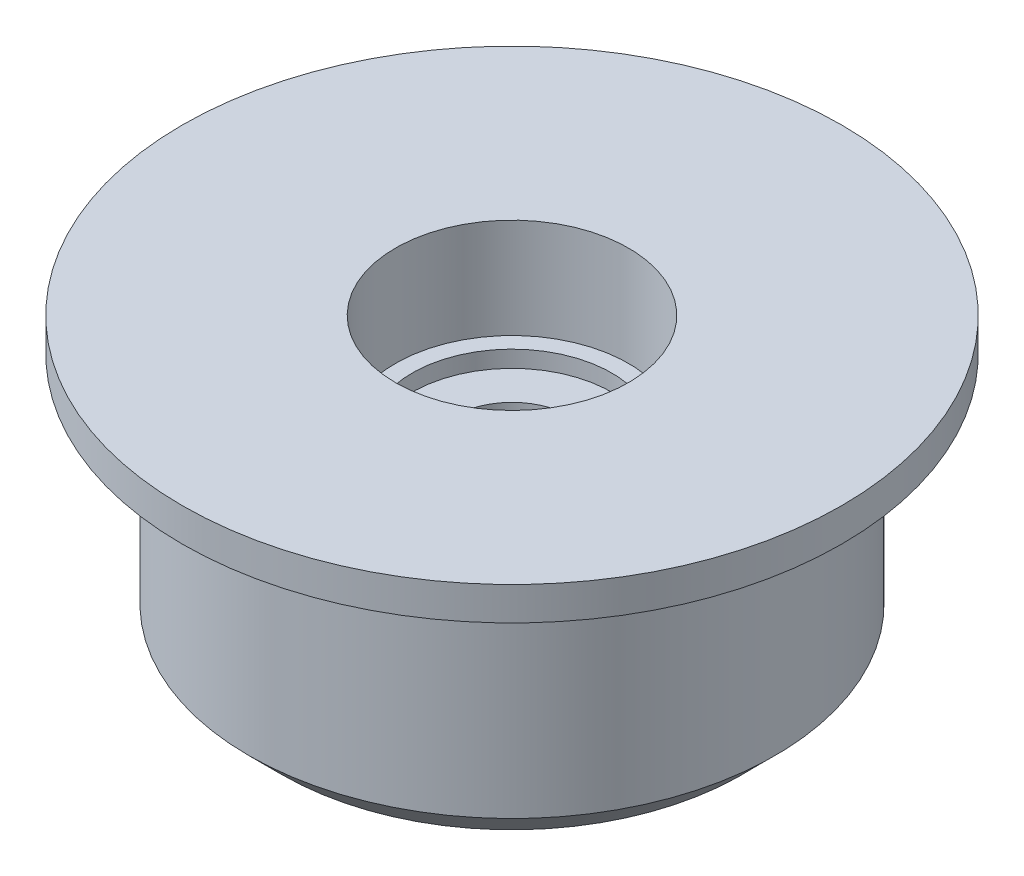
ISO-10303-21;
HEADER;
FILE_DESCRIPTION(('STEP AP214'),'2;1');
FILE_NAME('part.step','',(''),(''),'','','');
FILE_SCHEMA(('AUTOMOTIVE_DESIGN { 1 0 10303 214 1 1 1 1 }'));
ENDSEC;
DATA;
#1=APPLICATION_CONTEXT('core data for automotive mechanical design processes');
#2=APPLICATION_PROTOCOL_DEFINITION('international standard','automotive_design',2000,#1);
#3=PRODUCT_CONTEXT('',#1,'mechanical');
#4=PRODUCT('Part','Part','',(#3));
#5=PRODUCT_RELATED_PRODUCT_CATEGORY('part','',(#4));
#6=PRODUCT_DEFINITION_FORMATION('','',#4);
#7=PRODUCT_DEFINITION_CONTEXT('part definition',#1,'design');
#8=PRODUCT_DEFINITION('design','',#6,#7);
#9=PRODUCT_DEFINITION_SHAPE('','',#8);
#10=(LENGTH_UNIT() NAMED_UNIT(*) SI_UNIT(.MILLI.,.METRE.));
#11=(NAMED_UNIT(*) PLANE_ANGLE_UNIT() SI_UNIT($,.RADIAN.));
#12=(NAMED_UNIT(*) SI_UNIT($,.STERADIAN.) SOLID_ANGLE_UNIT());
#13=UNCERTAINTY_MEASURE_WITH_UNIT(LENGTH_MEASURE(1.E-05),#10,'distance_accuracy_value','');
#14=(GEOMETRIC_REPRESENTATION_CONTEXT(3) GLOBAL_UNCERTAINTY_ASSIGNED_CONTEXT((#13)) GLOBAL_UNIT_ASSIGNED_CONTEXT((#10,
#11,#12)) REPRESENTATION_CONTEXT('',''));
#15=CARTESIAN_POINT('',(0.,0.,0.));
#16=DIRECTION('',(0.,0.,1.));
#17=DIRECTION('',(1.,0.,0.));
#18=AXIS2_PLACEMENT_3D('',#15,#16,#17);
#19=CARTESIAN_POINT('',(0.,37.275,0.));
#20=DIRECTION('',(0.,1.,0.));
#21=DIRECTION('',(0.,0.,1.));
#22=AXIS2_PLACEMENT_3D('',#19,#20,#21);
#23=CYLINDRICAL_SURFACE('',#22,1.75);
#24=CARTESIAN_POINT('',(0.,0.,0.));
#25=DIRECTION('',(0.,1.,0.));
#26=DIRECTION('',(0.,0.,1.));
#27=AXIS2_PLACEMENT_3D('',#24,#25,#26);
#28=CIRCLE('',#27,1.75);
#29=CARTESIAN_POINT('',(0.,0.,1.75));
#30=VERTEX_POINT('',#29);
#31=EDGE_CURVE('E41',#30,#30,#28,.T.);
#32=ORIENTED_EDGE('',*,*,#31,.F.);
#33=EDGE_LOOP('',(#32));
#34=FACE_BOUND('',#33,.T.);
#35=CARTESIAN_POINT('',(0.,5.,0.));
#36=DIRECTION('',(0.,1.,0.));
#37=DIRECTION('',(0.,0.,1.));
#38=AXIS2_PLACEMENT_3D('',#35,#36,#37);
#39=CIRCLE('',#38,1.75);
#40=CARTESIAN_POINT('',(0.,5.,1.75));
#41=VERTEX_POINT('',#40);
#42=EDGE_CURVE('E68',#41,#41,#39,.T.);
#43=ORIENTED_EDGE('',*,*,#42,.T.);
#44=EDGE_LOOP('',(#43));
#45=FACE_BOUND('',#44,.T.);
#46=ADVANCED_FACE('F30',(#34,#45),#23,.F.);
#47=CARTESIAN_POINT('',(1.75,0.,0.));
#48=DIRECTION('',(0.,1.,0.));
#49=DIRECTION('',(0.,0.,1.));
#50=AXIS2_PLACEMENT_3D('',#47,#48,#49);
#51=PLANE('',#50);
#52=CARTESIAN_POINT('',(0.,0.,0.));
#53=DIRECTION('',(0.,1.,0.));
#54=DIRECTION('',(0.,0.,1.));
#55=AXIS2_PLACEMENT_3D('',#52,#53,#54);
#56=CIRCLE('',#55,6.9);
#57=CARTESIAN_POINT('',(0.,0.,6.9));
#58=VERTEX_POINT('',#57);
#59=EDGE_CURVE('E10',#58,#58,#56,.F.);
#60=ORIENTED_EDGE('',*,*,#59,.T.);
#61=EDGE_LOOP('',(#60));
#62=FACE_BOUND('',#61,.T.);
#63=ORIENTED_EDGE('',*,*,#31,.T.);
#64=EDGE_LOOP('',(#63));
#65=FACE_BOUND('',#64,.T.);
#66=ADVANCED_FACE('F117',(#62,#65),#51,.F.);
#67=CARTESIAN_POINT('',(0.,37.275,0.));
#68=DIRECTION('',(0.,1.,0.));
#69=DIRECTION('',(0.,0.,1.));
#70=AXIS2_PLACEMENT_3D('',#67,#68,#69);
#71=CYLINDRICAL_SURFACE('',#70,7.9);
#72=CARTESIAN_POINT('',(0.,1.,0.));
#73=DIRECTION('',(0.,1.,0.));
#74=DIRECTION('',(0.,0.,1.));
#75=AXIS2_PLACEMENT_3D('',#72,#73,#74);
#76=CIRCLE('',#75,7.9);
#77=CARTESIAN_POINT('',(0.,1.,7.9));
#78=VERTEX_POINT('',#77);
#79=EDGE_CURVE('E37',#78,#78,#76,.T.);
#80=ORIENTED_EDGE('',*,*,#79,.T.);
#81=EDGE_LOOP('',(#80));
#82=FACE_BOUND('',#81,.T.);
#83=CARTESIAN_POINT('',(0.,7.5,0.));
#84=DIRECTION('',(0.,1.,0.));
#85=DIRECTION('',(0.,0.,1.));
#86=AXIS2_PLACEMENT_3D('',#83,#84,#85);
#87=CIRCLE('',#86,7.9);
#88=CARTESIAN_POINT('',(0.,7.5,7.9));
#89=VERTEX_POINT('',#88);
#90=EDGE_CURVE('E45',#89,#89,#87,.T.);
#91=ORIENTED_EDGE('',*,*,#90,.F.);
#92=EDGE_LOOP('',(#91));
#93=FACE_BOUND('',#92,.T.);
#94=ADVANCED_FACE('F112',(#82,#93),#71,.T.);
#95=CARTESIAN_POINT('',(9.9,7.5,0.));
#96=DIRECTION('',(0.,1.,0.));
#97=DIRECTION('',(0.,0.,1.));
#98=AXIS2_PLACEMENT_3D('',#95,#96,#97);
#99=PLANE('',#98);
#100=CARTESIAN_POINT('',(0.,7.5,0.));
#101=DIRECTION('',(0.,1.,0.));
#102=DIRECTION('',(0.,0.,1.));
#103=AXIS2_PLACEMENT_3D('',#100,#101,#102);
#104=CIRCLE('',#103,9.9);
#105=CARTESIAN_POINT('',(0.,7.5,9.9));
#106=VERTEX_POINT('',#105);
#107=EDGE_CURVE('E50',#106,#106,#104,.T.);
#108=ORIENTED_EDGE('',*,*,#107,.F.);
#109=EDGE_LOOP('',(#108));
#110=FACE_BOUND('',#109,.T.);
#111=ORIENTED_EDGE('',*,*,#90,.T.);
#112=EDGE_LOOP('',(#111));
#113=FACE_BOUND('',#112,.T.);
#114=ADVANCED_FACE('F106',(#110,#113),#99,.F.);
#115=CARTESIAN_POINT('',(0.,37.275,0.));
#116=DIRECTION('',(0.,1.,0.));
#117=DIRECTION('',(0.,0.,1.));
#118=AXIS2_PLACEMENT_3D('',#115,#116,#117);
#119=CYLINDRICAL_SURFACE('',#118,9.9);
#120=CARTESIAN_POINT('',(0.,8.5,0.));
#121=DIRECTION('',(0.,1.,0.));
#122=DIRECTION('',(0.,0.,1.));
#123=AXIS2_PLACEMENT_3D('',#120,#121,#122);
#124=CIRCLE('',#123,9.9);
#125=CARTESIAN_POINT('',(0.,8.5,9.9));
#126=VERTEX_POINT('',#125);
#127=EDGE_CURVE('E53',#126,#126,#124,.T.);
#128=ORIENTED_EDGE('',*,*,#127,.F.);
#129=EDGE_LOOP('',(#128));
#130=FACE_BOUND('',#129,.T.);
#131=ORIENTED_EDGE('',*,*,#107,.T.);
#132=EDGE_LOOP('',(#131));
#133=FACE_BOUND('',#132,.T.);
#134=ADVANCED_FACE('F100',(#130,#133),#119,.T.);
#135=CARTESIAN_POINT('',(3.5,8.5,0.));
#136=DIRECTION('',(0.,-1.,0.));
#137=DIRECTION('',(0.,0.,-1.));
#138=AXIS2_PLACEMENT_3D('',#135,#136,#137);
#139=PLANE('',#138);
#140=CARTESIAN_POINT('',(0.,8.5,0.));
#141=DIRECTION('',(0.,1.,0.));
#142=DIRECTION('',(0.,0.,1.));
#143=AXIS2_PLACEMENT_3D('',#140,#141,#142);
#144=CIRCLE('',#143,3.5);
#145=CARTESIAN_POINT('',(0.,8.5,3.5));
#146=VERTEX_POINT('',#145);
#147=EDGE_CURVE('E56',#146,#146,#144,.T.);
#148=ORIENTED_EDGE('',*,*,#147,.F.);
#149=EDGE_LOOP('',(#148));
#150=FACE_BOUND('',#149,.T.);
#151=ORIENTED_EDGE('',*,*,#127,.T.);
#152=EDGE_LOOP('',(#151));
#153=FACE_BOUND('',#152,.T.);
#154=ADVANCED_FACE('F94',(#150,#153),#139,.F.);
#155=CARTESIAN_POINT('',(0.,37.275,0.));
#156=DIRECTION('',(0.,1.,0.));
#157=DIRECTION('',(0.,0.,1.));
#158=AXIS2_PLACEMENT_3D('',#155,#156,#157);
#159=CYLINDRICAL_SURFACE('',#158,3.5);
#160=CARTESIAN_POINT('',(0.,5.50000000000001,0.));
#161=DIRECTION('',(0.,1.,0.));
#162=DIRECTION('',(0.,0.,1.));
#163=AXIS2_PLACEMENT_3D('',#160,#161,#162);
#164=CIRCLE('',#163,3.5);
#165=CARTESIAN_POINT('',(0.,5.50000000000001,3.5));
#166=VERTEX_POINT('',#165);
#167=EDGE_CURVE('E59',#166,#166,#164,.T.);
#168=ORIENTED_EDGE('',*,*,#167,.F.);
#169=EDGE_LOOP('',(#168));
#170=FACE_BOUND('',#169,.T.);
#171=ORIENTED_EDGE('',*,*,#147,.T.);
#172=EDGE_LOOP('',(#171));
#173=FACE_BOUND('',#172,.T.);
#174=ADVANCED_FACE('F88',(#170,#173),#159,.F.);
#175=CARTESIAN_POINT('',(3.5,5.5,0.));
#176=DIRECTION('',(0.,-1.,0.));
#177=DIRECTION('',(0.,0.,-1.));
#178=AXIS2_PLACEMENT_3D('',#175,#176,#177);
#179=PLANE('',#178);
#180=CARTESIAN_POINT('',(0.,5.50000000000001,0.));
#181=DIRECTION('',(0.,1.,0.));
#182=DIRECTION('',(0.,0.,1.));
#183=AXIS2_PLACEMENT_3D('',#180,#181,#182);
#184=CIRCLE('',#183,3.);
#185=CARTESIAN_POINT('',(0.,5.50000000000001,3.));
#186=VERTEX_POINT('',#185);
#187=EDGE_CURVE('E62',#186,#186,#184,.T.);
#188=ORIENTED_EDGE('',*,*,#187,.F.);
#189=EDGE_LOOP('',(#188));
#190=FACE_BOUND('',#189,.T.);
#191=ORIENTED_EDGE('',*,*,#167,.T.);
#192=EDGE_LOOP('',(#191));
#193=FACE_BOUND('',#192,.T.);
#194=ADVANCED_FACE('F82',(#190,#193),#179,.F.);
#195=CARTESIAN_POINT('',(0.,37.275,0.));
#196=DIRECTION('',(0.,1.,0.));
#197=DIRECTION('',(0.,0.,1.));
#198=AXIS2_PLACEMENT_3D('',#195,#196,#197);
#199=CYLINDRICAL_SURFACE('',#198,3.);
#200=CARTESIAN_POINT('',(0.,5.,0.));
#201=DIRECTION('',(0.,1.,0.));
#202=DIRECTION('',(0.,0.,1.));
#203=AXIS2_PLACEMENT_3D('',#200,#201,#202);
#204=CIRCLE('',#203,3.);
#205=CARTESIAN_POINT('',(0.,5.,3.));
#206=VERTEX_POINT('',#205);
#207=EDGE_CURVE('E65',#206,#206,#204,.T.);
#208=ORIENTED_EDGE('',*,*,#207,.F.);
#209=EDGE_LOOP('',(#208));
#210=FACE_BOUND('',#209,.T.);
#211=ORIENTED_EDGE('',*,*,#187,.T.);
#212=EDGE_LOOP('',(#211));
#213=FACE_BOUND('',#212,.T.);
#214=ADVANCED_FACE('F76',(#210,#213),#199,.F.);
#215=CARTESIAN_POINT('',(3.,5.,0.));
#216=DIRECTION('',(0.,-1.,0.));
#217=DIRECTION('',(0.,0.,-1.));
#218=AXIS2_PLACEMENT_3D('',#215,#216,#217);
#219=PLANE('',#218);
#220=ORIENTED_EDGE('',*,*,#42,.F.);
#221=EDGE_LOOP('',(#220));
#222=FACE_BOUND('',#221,.T.);
#223=ORIENTED_EDGE('',*,*,#207,.T.);
#224=EDGE_LOOP('',(#223));
#225=FACE_BOUND('',#224,.T.);
#226=ADVANCED_FACE('F73',(#222,#225),#219,.F.);
#227=CARTESIAN_POINT('',(0.,1.,0.));
#228=DIRECTION('',(0.,1.,0.));
#229=DIRECTION('',(0.,0.,1.));
#230=AXIS2_PLACEMENT_3D('',#227,#228,#229);
#231=CONICAL_SURFACE('',#230,7.9,0.785398163397448);
#232=ORIENTED_EDGE('',*,*,#59,.F.);
#233=EDGE_LOOP('',(#232));
#234=FACE_BOUND('',#233,.T.);
#235=ORIENTED_EDGE('',*,*,#79,.F.);
#236=EDGE_LOOP('',(#235));
#237=FACE_BOUND('',#236,.T.);
#238=ADVANCED_FACE('F32',(#234,#237),#231,.T.);
#239=CLOSED_SHELL('',(#46,#66,#94,#114,#134,#154,#174,#194,#214,#226,#238));
#240=MANIFOLD_SOLID_BREP('B2',#239);
#241=ADVANCED_BREP_SHAPE_REPRESENTATION('',(#18,#240),#14);
#242=SHAPE_DEFINITION_REPRESENTATION(#9,#241);
ENDSEC;
END-ISO-10303-21;
